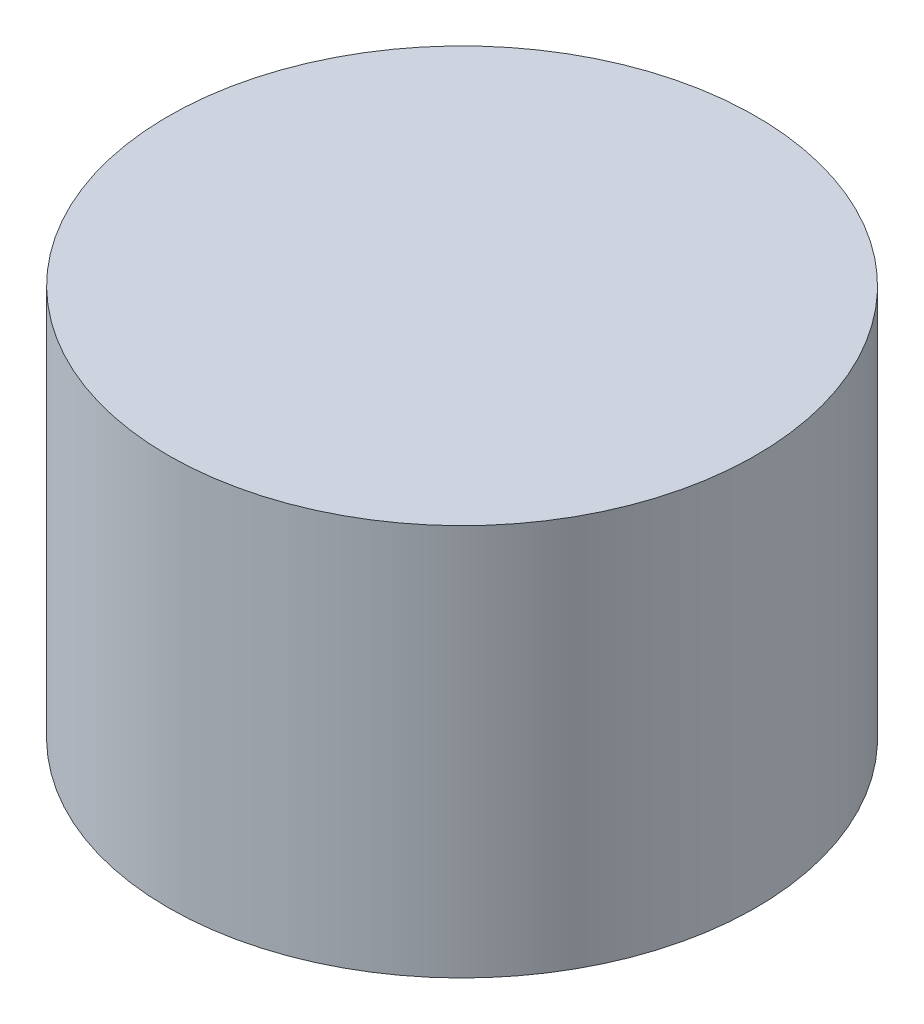
ISO-10303-21;
HEADER;
FILE_DESCRIPTION(('STEP AP214'),'2;1');
FILE_NAME('part.step','',(''),(''),'','','');
FILE_SCHEMA(('AUTOMOTIVE_DESIGN { 1 0 10303 214 1 1 1 1 }'));
ENDSEC;
DATA;
#1=APPLICATION_CONTEXT('core data for automotive mechanical design processes');
#2=APPLICATION_PROTOCOL_DEFINITION('international standard','automotive_design',2000,#1);
#3=PRODUCT_CONTEXT('',#1,'mechanical');
#4=PRODUCT('Part','Part','',(#3));
#5=PRODUCT_RELATED_PRODUCT_CATEGORY('part','',(#4));
#6=PRODUCT_DEFINITION_FORMATION('','',#4);
#7=PRODUCT_DEFINITION_CONTEXT('part definition',#1,'design');
#8=PRODUCT_DEFINITION('design','',#6,#7);
#9=PRODUCT_DEFINITION_SHAPE('','',#8);
#10=(LENGTH_UNIT() NAMED_UNIT(*) SI_UNIT(.MILLI.,.METRE.));
#11=(NAMED_UNIT(*) PLANE_ANGLE_UNIT() SI_UNIT($,.RADIAN.));
#12=(NAMED_UNIT(*) SI_UNIT($,.STERADIAN.) SOLID_ANGLE_UNIT());
#13=UNCERTAINTY_MEASURE_WITH_UNIT(LENGTH_MEASURE(1.E-05),#10,'distance_accuracy_value','');
#14=(GEOMETRIC_REPRESENTATION_CONTEXT(3) GLOBAL_UNCERTAINTY_ASSIGNED_CONTEXT((#13)) GLOBAL_UNIT_ASSIGNED_CONTEXT((#10,
#11,#12)) REPRESENTATION_CONTEXT('',''));
#15=CARTESIAN_POINT('',(0.,0.,0.));
#16=DIRECTION('',(0.,0.,1.));
#17=DIRECTION('',(1.,0.,0.));
#18=AXIS2_PLACEMENT_3D('',#15,#16,#17);
#19=CARTESIAN_POINT('',(0.,1.,0.));
#20=DIRECTION('',(0.,-1.,0.));
#21=DIRECTION('',(0.,0.,-1.));
#22=AXIS2_PLACEMENT_3D('',#19,#20,#21);
#23=CYLINDRICAL_SURFACE('',#22,1.5);
#24=CARTESIAN_POINT('',(0.,1.,0.));
#25=DIRECTION('',(0.,1.,0.));
#26=DIRECTION('',(0.,0.,1.));
#27=AXIS2_PLACEMENT_3D('',#24,#25,#26);
#28=CIRCLE('',#27,1.5);
#29=CARTESIAN_POINT('',(0.,1.,1.5));
#30=VERTEX_POINT('',#29);
#31=EDGE_CURVE('E10',#30,#30,#28,.T.);
#32=ORIENTED_EDGE('',*,*,#31,.F.);
#33=EDGE_LOOP('',(#32));
#34=FACE_BOUND('',#33,.T.);
#35=CARTESIAN_POINT('',(0.,-1.,0.));
#36=DIRECTION('',(0.,1.,0.));
#37=DIRECTION('',(0.,0.,1.));
#38=AXIS2_PLACEMENT_3D('',#35,#36,#37);
#39=CIRCLE('',#38,1.5);
#40=CARTESIAN_POINT('',(0.,-1.,1.5));
#41=VERTEX_POINT('',#40);
#42=EDGE_CURVE('E40',#41,#41,#39,.T.);
#43=ORIENTED_EDGE('',*,*,#42,.T.);
#44=EDGE_LOOP('',(#43));
#45=FACE_BOUND('',#44,.T.);
#46=ADVANCED_FACE('F37',(#34,#45),#23,.T.);
#47=CARTESIAN_POINT('',(0.,1.,0.));
#48=DIRECTION('',(0.,1.,0.));
#49=DIRECTION('',(0.,0.,1.));
#50=AXIS2_PLACEMENT_3D('',#47,#48,#49);
#51=PLANE('',#50);
#52=ORIENTED_EDGE('',*,*,#31,.T.);
#53=EDGE_LOOP('',(#52));
#54=FACE_BOUND('',#53,.T.);
#55=ADVANCED_FACE('F52',(#54),#51,.T.);
#56=CARTESIAN_POINT('',(0.,-1.,0.));
#57=DIRECTION('',(0.,1.,0.));
#58=DIRECTION('',(0.,0.,1.));
#59=AXIS2_PLACEMENT_3D('',#56,#57,#58);
#60=PLANE('',#59);
#61=ORIENTED_EDGE('',*,*,#42,.F.);
#62=EDGE_LOOP('',(#61));
#63=FACE_BOUND('',#62,.T.);
#64=ADVANCED_FACE('F50',(#63),#60,.F.);
#65=CLOSED_SHELL('',(#46,#55,#64));
#66=MANIFOLD_SOLID_BREP('B2',#65);
#67=ADVANCED_BREP_SHAPE_REPRESENTATION('',(#18,#66),#14);
#68=SHAPE_DEFINITION_REPRESENTATION(#9,#67);
ENDSEC;
END-ISO-10303-21;
